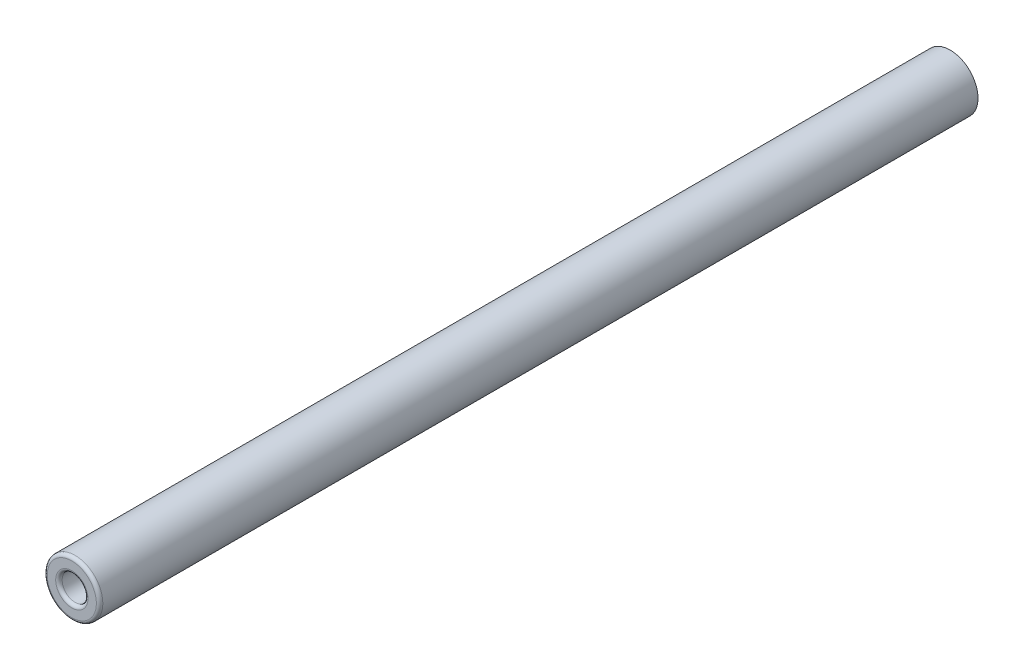
ISO-10303-21;
HEADER;
FILE_DESCRIPTION(('STEP AP214'),'2;1');
FILE_NAME('part.step','',(''),(''),'','','');
FILE_SCHEMA(('AUTOMOTIVE_DESIGN { 1 0 10303 214 1 1 1 1 }'));
ENDSEC;
DATA;
#1=APPLICATION_CONTEXT('core data for automotive mechanical design processes');
#2=APPLICATION_PROTOCOL_DEFINITION('international standard','automotive_design',2000,#1);
#3=PRODUCT_CONTEXT('',#1,'mechanical');
#4=PRODUCT('Part','Part','',(#3));
#5=PRODUCT_RELATED_PRODUCT_CATEGORY('part','',(#4));
#6=PRODUCT_DEFINITION_FORMATION('','',#4);
#7=PRODUCT_DEFINITION_CONTEXT('part definition',#1,'design');
#8=PRODUCT_DEFINITION('design','',#6,#7);
#9=PRODUCT_DEFINITION_SHAPE('','',#8);
#10=(LENGTH_UNIT() NAMED_UNIT(*) SI_UNIT(.MILLI.,.METRE.));
#11=(NAMED_UNIT(*) PLANE_ANGLE_UNIT() SI_UNIT($,.RADIAN.));
#12=(NAMED_UNIT(*) SI_UNIT($,.STERADIAN.) SOLID_ANGLE_UNIT());
#13=UNCERTAINTY_MEASURE_WITH_UNIT(LENGTH_MEASURE(1.E-05),#10,'distance_accuracy_value','');
#14=(GEOMETRIC_REPRESENTATION_CONTEXT(3) GLOBAL_UNCERTAINTY_ASSIGNED_CONTEXT((#13)) GLOBAL_UNIT_ASSIGNED_CONTEXT((#10,
#11,#12)) REPRESENTATION_CONTEXT('',''));
#15=CARTESIAN_POINT('',(0.,0.,0.));
#16=DIRECTION('',(0.,0.,1.));
#17=DIRECTION('',(1.,0.,0.));
#18=AXIS2_PLACEMENT_3D('',#15,#16,#17);
#19=CARTESIAN_POINT('',(0.,0.,340.));
#20=DIRECTION('',(0.,0.,-1.));
#21=DIRECTION('',(-1.,0.,0.));
#22=AXIS2_PLACEMENT_3D('',#19,#20,#21);
#23=CYLINDRICAL_SURFACE('',#22,10.75);
#24=CARTESIAN_POINT('',(0.,0.,338.75));
#25=DIRECTION('',(0.,0.,1.));
#26=DIRECTION('',(1.,0.,0.));
#27=AXIS2_PLACEMENT_3D('',#24,#25,#26);
#28=CIRCLE('',#27,10.75);
#29=CARTESIAN_POINT('',(10.75,0.,338.75));
#30=VERTEX_POINT('',#29);
#31=EDGE_CURVE('E45',#30,#30,#28,.F.);
#32=ORIENTED_EDGE('',*,*,#31,.T.);
#33=EDGE_LOOP('',(#32));
#34=FACE_BOUND('',#33,.T.);
#35=CARTESIAN_POINT('',(0.,0.,0.));
#36=DIRECTION('',(0.,0.,1.));
#37=DIRECTION('',(1.,0.,0.));
#38=AXIS2_PLACEMENT_3D('',#35,#36,#37);
#39=CIRCLE('',#38,10.75);
#40=CARTESIAN_POINT('',(10.75,0.,0.));
#41=VERTEX_POINT('',#40);
#42=EDGE_CURVE('E61',#41,#41,#39,.T.);
#43=ORIENTED_EDGE('',*,*,#42,.T.);
#44=EDGE_LOOP('',(#43));
#45=FACE_BOUND('',#44,.T.);
#46=ADVANCED_FACE('F37',(#34,#45),#23,.T.);
#47=CARTESIAN_POINT('',(0.,0.,340.));
#48=DIRECTION('',(0.,0.,1.));
#49=DIRECTION('',(1.,0.,0.));
#50=AXIS2_PLACEMENT_3D('',#47,#48,#49);
#51=PLANE('',#50);
#52=CARTESIAN_POINT('',(0.,0.,340.));
#53=DIRECTION('',(0.,0.,1.));
#54=DIRECTION('',(1.,0.,0.));
#55=AXIS2_PLACEMENT_3D('',#52,#53,#54);
#56=CIRCLE('',#55,9.5);
#57=CARTESIAN_POINT('',(9.5,0.,340.));
#58=VERTEX_POINT('',#57);
#59=EDGE_CURVE('E50',#58,#58,#56,.T.);
#60=ORIENTED_EDGE('',*,*,#59,.T.);
#61=EDGE_LOOP('',(#60));
#62=FACE_BOUND('',#61,.T.);
#63=CARTESIAN_POINT('',(0.,0.,340.));
#64=DIRECTION('',(0.,0.,1.));
#65=DIRECTION('',(1.,0.,0.));
#66=AXIS2_PLACEMENT_3D('',#63,#64,#65);
#67=CIRCLE('',#66,6.25);
#68=CARTESIAN_POINT('',(6.25,0.,340.));
#69=VERTEX_POINT('',#68);
#70=EDGE_CURVE('E55',#69,#69,#67,.F.);
#71=ORIENTED_EDGE('',*,*,#70,.T.);
#72=EDGE_LOOP('',(#71));
#73=FACE_BOUND('',#72,.T.);
#74=ADVANCED_FACE('F82',(#62,#73),#51,.T.);
#75=CARTESIAN_POINT('',(0.,0.,0.));
#76=DIRECTION('',(0.,0.,1.));
#77=DIRECTION('',(1.,0.,0.));
#78=AXIS2_PLACEMENT_3D('',#75,#76,#77);
#79=PLANE('',#78);
#80=ORIENTED_EDGE('',*,*,#42,.F.);
#81=EDGE_LOOP('',(#80));
#82=FACE_BOUND('',#81,.T.);
#83=ADVANCED_FACE('F74',(#82),#79,.F.);
#84=CARTESIAN_POINT('',(0.,0.,290.));
#85=DIRECTION('',(0.,0.,1.));
#86=DIRECTION('',(1.,0.,0.));
#87=AXIS2_PLACEMENT_3D('',#84,#85,#86);
#88=CYLINDRICAL_SURFACE('',#87,5.);
#89=CARTESIAN_POINT('',(0.,0.,338.75));
#90=DIRECTION('',(0.,0.,1.));
#91=DIRECTION('',(1.,0.,0.));
#92=AXIS2_PLACEMENT_3D('',#89,#90,#91);
#93=CIRCLE('',#92,5.);
#94=CARTESIAN_POINT('',(5.,0.,338.75));
#95=VERTEX_POINT('',#94);
#96=EDGE_CURVE('E10',#95,#95,#93,.T.);
#97=ORIENTED_EDGE('',*,*,#96,.T.);
#98=EDGE_LOOP('',(#97));
#99=FACE_BOUND('',#98,.T.);
#100=CARTESIAN_POINT('',(0.,0.,290.));
#101=DIRECTION('',(0.,0.,1.));
#102=DIRECTION('',(1.,0.,0.));
#103=AXIS2_PLACEMENT_3D('',#100,#101,#102);
#104=CIRCLE('',#103,5.);
#105=CARTESIAN_POINT('',(5.,0.,290.));
#106=VERTEX_POINT('',#105);
#107=EDGE_CURVE('E65',#106,#106,#104,.T.);
#108=ORIENTED_EDGE('',*,*,#107,.F.);
#109=EDGE_LOOP('',(#108));
#110=FACE_BOUND('',#109,.T.);
#111=ADVANCED_FACE('F72',(#99,#110),#88,.F.);
#112=CARTESIAN_POINT('',(0.,0.,290.));
#113=DIRECTION('',(0.,0.,1.));
#114=DIRECTION('',(1.,0.,0.));
#115=AXIS2_PLACEMENT_3D('',#112,#113,#114);
#116=PLANE('',#115);
#117=ORIENTED_EDGE('',*,*,#107,.T.);
#118=EDGE_LOOP('',(#117));
#119=FACE_BOUND('',#118,.T.);
#120=ADVANCED_FACE('F70',(#119),#116,.T.);
#121=CARTESIAN_POINT('',(0.,0.,338.75));
#122=DIRECTION('',(0.,0.,1.));
#123=DIRECTION('',(1.,0.,0.));
#124=AXIS2_PLACEMENT_3D('',#121,#122,#123);
#125=TOROIDAL_SURFACE('',#124,9.5,1.25);
#126=ORIENTED_EDGE('',*,*,#31,.F.);
#127=EDGE_LOOP('',(#126));
#128=FACE_BOUND('',#127,.T.);
#129=ORIENTED_EDGE('',*,*,#59,.F.);
#130=EDGE_LOOP('',(#129));
#131=FACE_BOUND('',#130,.T.);
#132=ADVANCED_FACE('F80',(#128,#131),#125,.T.);
#133=CARTESIAN_POINT('',(0.,0.,338.75));
#134=DIRECTION('',(0.,0.,1.));
#135=DIRECTION('',(1.,0.,0.));
#136=AXIS2_PLACEMENT_3D('',#133,#134,#135);
#137=TOROIDAL_SURFACE('',#136,6.25,1.25);
#138=ORIENTED_EDGE('',*,*,#70,.F.);
#139=EDGE_LOOP('',(#138));
#140=FACE_BOUND('',#139,.T.);
#141=ORIENTED_EDGE('',*,*,#96,.F.);
#142=EDGE_LOOP('',(#141));
#143=FACE_BOUND('',#142,.T.);
#144=ADVANCED_FACE('F39',(#140,#143),#137,.T.);
#145=CLOSED_SHELL('',(#46,#74,#83,#111,#120,#132,#144));
#146=MANIFOLD_SOLID_BREP('B2',#145);
#147=ADVANCED_BREP_SHAPE_REPRESENTATION('',(#18,#146),#14);
#148=SHAPE_DEFINITION_REPRESENTATION(#9,#147);
ENDSEC;
END-ISO-10303-21;
